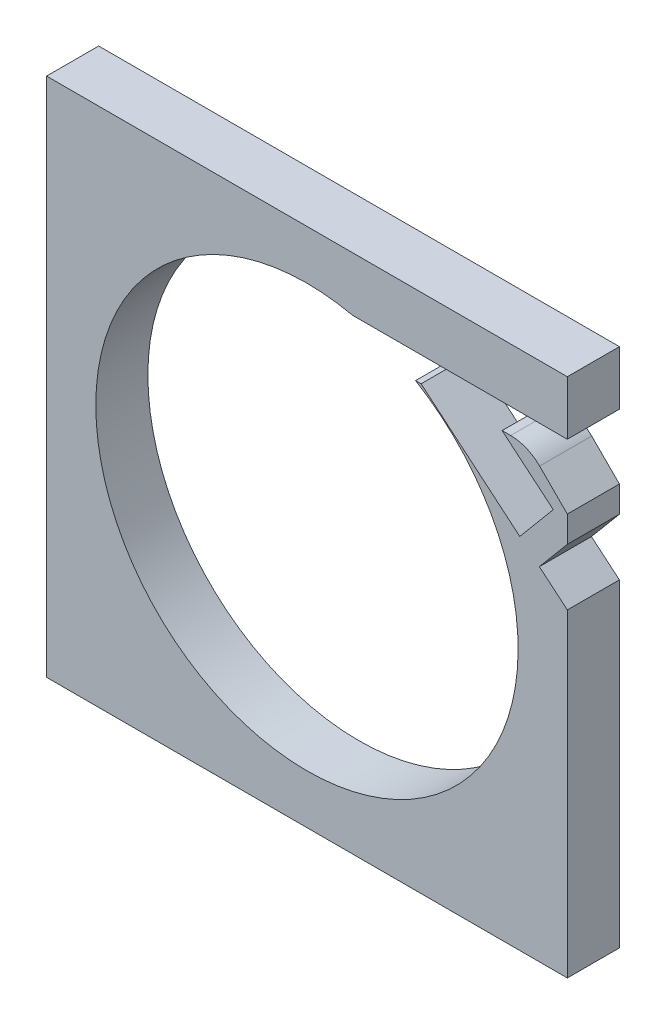
ISO-10303-21;
HEADER;
FILE_DESCRIPTION(('STEP AP214'),'2;1');
FILE_NAME('part.step','',(''),(''),'','','');
FILE_SCHEMA(('AUTOMOTIVE_DESIGN { 1 0 10303 214 1 1 1 1 }'));
ENDSEC;
DATA;
#1=APPLICATION_CONTEXT('core data for automotive mechanical design processes');
#2=APPLICATION_PROTOCOL_DEFINITION('international standard','automotive_design',2000,#1);
#3=PRODUCT_CONTEXT('',#1,'mechanical');
#4=PRODUCT('Part','Part','',(#3));
#5=PRODUCT_RELATED_PRODUCT_CATEGORY('part','',(#4));
#6=PRODUCT_DEFINITION_FORMATION('','',#4);
#7=PRODUCT_DEFINITION_CONTEXT('part definition',#1,'design');
#8=PRODUCT_DEFINITION('design','',#6,#7);
#9=PRODUCT_DEFINITION_SHAPE('','',#8);
#10=(LENGTH_UNIT() NAMED_UNIT(*) SI_UNIT(.MILLI.,.METRE.));
#11=(NAMED_UNIT(*) PLANE_ANGLE_UNIT() SI_UNIT($,.RADIAN.));
#12=(NAMED_UNIT(*) SI_UNIT($,.STERADIAN.) SOLID_ANGLE_UNIT());
#13=UNCERTAINTY_MEASURE_WITH_UNIT(LENGTH_MEASURE(1.E-05),#10,'distance_accuracy_value','');
#14=(GEOMETRIC_REPRESENTATION_CONTEXT(3) GLOBAL_UNCERTAINTY_ASSIGNED_CONTEXT((#13)) GLOBAL_UNIT_ASSIGNED_CONTEXT((#10,
#11,#12)) REPRESENTATION_CONTEXT('',''));
#15=CARTESIAN_POINT('',(0.,0.,0.));
#16=DIRECTION('',(0.,0.,1.));
#17=DIRECTION('',(1.,0.,0.));
#18=AXIS2_PLACEMENT_3D('',#15,#16,#17);
#19=CARTESIAN_POINT('',(63.5,63.5,12.7));
#20=DIRECTION('',(-1.,0.,0.));
#21=DIRECTION('',(0.,-1.,0.));
#22=AXIS2_PLACEMENT_3D('',#19,#20,#21);
#23=PLANE('',#22);
#24=DIRECTION('',(0.,1.,0.));
#25=VECTOR('',#24,1.);
#26=CARTESIAN_POINT('',(63.5,63.5,0.));
#27=LINE('',#26,#25);
#28=CARTESIAN_POINT('',(63.5,-63.5,0.));
#29=VERTEX_POINT('',#28);
#30=CARTESIAN_POINT('',(63.5,14.2427416836817,0.));
#31=VERTEX_POINT('',#30);
#32=EDGE_CURVE('E197',#29,#31,#27,.T.);
#33=ORIENTED_EDGE('',*,*,#32,.T.);
#34=DIRECTION('',(0.,0.,1.));
#35=VECTOR('',#34,1.);
#36=CARTESIAN_POINT('',(63.5,14.2427416836817,-0.000999999999999265));
#37=LINE('',#36,#35);
#38=CARTESIAN_POINT('',(63.5,14.2427416836817,12.7));
#39=VERTEX_POINT('',#38);
#40=EDGE_CURVE('E266',#31,#39,#37,.T.);
#41=ORIENTED_EDGE('',*,*,#40,.T.);
#42=DIRECTION('',(0.,1.,0.));
#43=VECTOR('',#42,1.);
#44=CARTESIAN_POINT('',(63.5,63.5,12.7));
#45=LINE('',#44,#43);
#46=CARTESIAN_POINT('',(63.5,-63.5,12.7));
#47=VERTEX_POINT('',#46);
#48=EDGE_CURVE('E185',#47,#39,#45,.T.);
#49=ORIENTED_EDGE('',*,*,#48,.F.);
#50=DIRECTION('',(0.,0.,-1.));
#51=VECTOR('',#50,1.);
#52=CARTESIAN_POINT('',(63.5,-63.5,12.7));
#53=LINE('',#52,#51);
#54=EDGE_CURVE('E196',#47,#29,#53,.T.);
#55=ORIENTED_EDGE('',*,*,#54,.T.);
#56=EDGE_LOOP('',(#33,#41,#49,#55));
#57=FACE_BOUND('',#56,.T.);
#58=ADVANCED_FACE('F32',(#57),#23,.F.);
#59=CARTESIAN_POINT('',(63.5,50.2852471751917,12.7));
#60=VERTEX_POINT('',#59);
#61=CARTESIAN_POINT('',(63.5,63.5,12.7));
#62=VERTEX_POINT('',#61);
#63=EDGE_CURVE('E190',#60,#62,#45,.T.);
#64=ORIENTED_EDGE('',*,*,#63,.F.);
#65=DIRECTION('',(0.,0.,1.));
#66=VECTOR('',#65,1.);
#67=CARTESIAN_POINT('',(63.5,50.2852471751917,-0.000999999999999265));
#68=LINE('',#67,#66);
#69=CARTESIAN_POINT('',(63.5,50.2852471751917,0.));
#70=VERTEX_POINT('',#69);
#71=EDGE_CURVE('E177',#70,#60,#68,.T.);
#72=ORIENTED_EDGE('',*,*,#71,.F.);
#73=CARTESIAN_POINT('',(63.5,63.5,0.));
#74=VERTEX_POINT('',#73);
#75=EDGE_CURVE('E179',#70,#74,#27,.T.);
#76=ORIENTED_EDGE('',*,*,#75,.T.);
#77=DIRECTION('',(0.,0.,-1.));
#78=VECTOR('',#77,1.);
#79=CARTESIAN_POINT('',(63.5,63.5,12.7));
#80=LINE('',#79,#78);
#81=EDGE_CURVE('E215',#62,#74,#80,.T.);
#82=ORIENTED_EDGE('',*,*,#81,.F.);
#83=EDGE_LOOP('',(#64,#72,#76,#82));
#84=FACE_BOUND('',#83,.T.);
#85=ADVANCED_FACE('F308',(#84),#23,.F.);
#86=CARTESIAN_POINT('',(63.5,28.0993720915561,12.7));
#87=VERTEX_POINT('',#86);
#88=CARTESIAN_POINT('',(63.5,34.4892924451917,12.7));
#89=VERTEX_POINT('',#88);
#90=EDGE_CURVE('E189',#87,#89,#45,.T.);
#91=ORIENTED_EDGE('',*,*,#90,.F.);
#92=DIRECTION('',(0.,0.,1.));
#93=VECTOR('',#92,1.);
#94=CARTESIAN_POINT('',(63.5,28.0993720915561,-0.000999999999999265));
#95=LINE('',#94,#93);
#96=CARTESIAN_POINT('',(63.5,28.0993720915561,0.));
#97=VERTEX_POINT('',#96);
#98=EDGE_CURVE('E269',#97,#87,#95,.T.);
#99=ORIENTED_EDGE('',*,*,#98,.F.);
#100=CARTESIAN_POINT('',(63.5,34.4892924451917,0.));
#101=VERTEX_POINT('',#100);
#102=EDGE_CURVE('E201',#97,#101,#27,.T.);
#103=ORIENTED_EDGE('',*,*,#102,.T.);
#104=DIRECTION('',(0.,0.,1.));
#105=VECTOR('',#104,1.);
#106=CARTESIAN_POINT('',(63.5,34.4892924451917,-0.000999999999999265));
#107=LINE('',#106,#105);
#108=EDGE_CURVE('E181',#101,#89,#107,.T.);
#109=ORIENTED_EDGE('',*,*,#108,.T.);
#110=EDGE_LOOP('',(#91,#99,#103,#109));
#111=FACE_BOUND('',#110,.T.);
#112=ADVANCED_FACE('F330',(#111),#23,.F.);
#113=CARTESIAN_POINT('',(-63.5,63.5,12.7));
#114=DIRECTION('',(0.,-1.,0.));
#115=DIRECTION('',(0.,0.,-1.));
#116=AXIS2_PLACEMENT_3D('',#113,#114,#115);
#117=PLANE('',#116);
#118=DIRECTION('',(-1.,0.,0.));
#119=VECTOR('',#118,1.);
#120=CARTESIAN_POINT('',(-63.5,63.5,0.));
#121=LINE('',#120,#119);
#122=CARTESIAN_POINT('',(-63.5,63.5,0.));
#123=VERTEX_POINT('',#122);
#124=EDGE_CURVE('E200',#74,#123,#121,.T.);
#125=ORIENTED_EDGE('',*,*,#124,.T.);
#126=DIRECTION('',(0.,0.,-1.));
#127=VECTOR('',#126,1.);
#128=CARTESIAN_POINT('',(-63.5,63.5,12.7));
#129=LINE('',#128,#127);
#130=CARTESIAN_POINT('',(-63.5,63.5,12.7));
#131=VERTEX_POINT('',#130);
#132=EDGE_CURVE('E212',#131,#123,#129,.T.);
#133=ORIENTED_EDGE('',*,*,#132,.F.);
#134=DIRECTION('',(-1.,0.,0.));
#135=VECTOR('',#134,1.);
#136=CARTESIAN_POINT('',(-63.5,63.5,12.7));
#137=LINE('',#136,#135);
#138=EDGE_CURVE('E188',#62,#131,#137,.T.);
#139=ORIENTED_EDGE('',*,*,#138,.F.);
#140=ORIENTED_EDGE('',*,*,#81,.T.);
#141=EDGE_LOOP('',(#125,#133,#139,#140));
#142=FACE_BOUND('',#141,.T.);
#143=ADVANCED_FACE('F314',(#142),#117,.F.);
#144=CARTESIAN_POINT('',(-63.5,63.5,12.7));
#145=DIRECTION('',(1.,0.,0.));
#146=DIRECTION('',(0.,0.,-1.));
#147=AXIS2_PLACEMENT_3D('',#144,#145,#146);
#148=PLANE('',#147);
#149=DIRECTION('',(0.,-1.,0.));
#150=VECTOR('',#149,1.);
#151=CARTESIAN_POINT('',(-63.5,63.5,0.));
#152=LINE('',#151,#150);
#153=CARTESIAN_POINT('',(-63.5,-63.5,0.));
#154=VERTEX_POINT('',#153);
#155=EDGE_CURVE('E203',#123,#154,#152,.T.);
#156=ORIENTED_EDGE('',*,*,#155,.T.);
#157=DIRECTION('',(0.,0.,-1.));
#158=VECTOR('',#157,1.);
#159=CARTESIAN_POINT('',(-63.5,-63.5,12.7));
#160=LINE('',#159,#158);
#161=CARTESIAN_POINT('',(-63.5,-63.5,12.7));
#162=VERTEX_POINT('',#161);
#163=EDGE_CURVE('E209',#162,#154,#160,.T.);
#164=ORIENTED_EDGE('',*,*,#163,.F.);
#165=DIRECTION('',(0.,-1.,0.));
#166=VECTOR('',#165,1.);
#167=CARTESIAN_POINT('',(-63.5,63.5,12.7));
#168=LINE('',#167,#166);
#169=EDGE_CURVE('E192',#131,#162,#168,.T.);
#170=ORIENTED_EDGE('',*,*,#169,.F.);
#171=ORIENTED_EDGE('',*,*,#132,.T.);
#172=EDGE_LOOP('',(#156,#164,#170,#171));
#173=FACE_BOUND('',#172,.T.);
#174=ADVANCED_FACE('F339',(#173),#148,.F.);
#175=CARTESIAN_POINT('',(-63.5,-63.5,12.7));
#176=DIRECTION('',(0.,1.,0.));
#177=DIRECTION('',(0.,0.,1.));
#178=AXIS2_PLACEMENT_3D('',#175,#176,#177);
#179=PLANE('',#178);
#180=DIRECTION('',(1.,0.,0.));
#181=VECTOR('',#180,1.);
#182=CARTESIAN_POINT('',(-63.5,-63.5,0.));
#183=LINE('',#182,#181);
#184=EDGE_CURVE('E205',#154,#29,#183,.T.);
#185=ORIENTED_EDGE('',*,*,#184,.T.);
#186=ORIENTED_EDGE('',*,*,#54,.F.);
#187=DIRECTION('',(1.,0.,0.));
#188=VECTOR('',#187,1.);
#189=CARTESIAN_POINT('',(-63.5,-63.5,12.7));
#190=LINE('',#189,#188);
#191=EDGE_CURVE('E194',#162,#47,#190,.T.);
#192=ORIENTED_EDGE('',*,*,#191,.F.);
#193=ORIENTED_EDGE('',*,*,#163,.T.);
#194=EDGE_LOOP('',(#185,#186,#192,#193));
#195=FACE_BOUND('',#194,.T.);
#196=ADVANCED_FACE('F350',(#195),#179,.F.);
#197=CARTESIAN_POINT('',(0.,0.,12.7));
#198=DIRECTION('',(0.,0.,1.));
#199=DIRECTION('',(1.,0.,0.));
#200=AXIS2_PLACEMENT_3D('',#197,#198,#199);
#201=PLANE('',#200);
#202=DIRECTION('',(0.707106781186551,-0.707106781186544,0.));
#203=VECTOR('',#202,1.);
#204=CARTESIAN_POINT('',(63.5,34.4892924451917,12.7));
#205=LINE('',#204,#203);
#206=CARTESIAN_POINT('',(56.7471306403647,41.2421618048269,12.7));
#207=VERTEX_POINT('',#206);
#208=EDGE_CURVE('E228',#207,#89,#205,.T.);
#209=ORIENTED_EDGE('',*,*,#208,.F.);
#210=CARTESIAN_POINT('',(49.6760628284993,34.1710939929614,12.7));
#211=DIRECTION('',(0.,0.,1.));
#212=DIRECTION('',(1.,0.,0.));
#213=AXIS2_PLACEMENT_3D('',#210,#211,#212);
#214=CIRCLE('',#213,10.);
#215=CARTESIAN_POINT('',(49.6760628284993,44.1710939929614,12.7));
#216=VERTEX_POINT('',#215);
#217=EDGE_CURVE('E54',#207,#216,#214,.T.);
#218=ORIENTED_EDGE('',*,*,#217,.T.);
#219=DIRECTION('',(1.,0.,0.));
#220=VECTOR('',#219,1.);
#221=CARTESIAN_POINT('',(57.1386467105627,44.1710939929614,12.7));
#222=LINE('',#221,#220);
#223=CARTESIAN_POINT('',(47.590471216118,44.1710939929614,12.7));
#224=VERTEX_POINT('',#223);
#225=EDGE_CURVE('E170',#224,#216,#222,.T.);
#226=ORIENTED_EDGE('',*,*,#225,.F.);
#227=DIRECTION('',(-0.766044443118977,0.64278760968654,0.));
#228=VECTOR('',#227,1.);
#229=CARTESIAN_POINT('',(41.495660788118,49.2852471751917,12.7));
#230=LINE('',#229,#228);
#231=CARTESIAN_POINT('',(60.0751818231,33.6951779272877,12.7));
#232=VERTEX_POINT('',#231);
#233=EDGE_CURVE('E252',#232,#224,#230,.T.);
#234=ORIENTED_EDGE('',*,*,#233,.F.);
#235=DIRECTION('',(0.64278760968654,0.766044443118977,0.));
#236=VECTOR('',#235,1.);
#237=CARTESIAN_POINT('',(60.0751818231,33.6951779272877,12.7));
#238=LINE('',#237,#236);
#239=CARTESIAN_POINT('',(51.9117791800809,23.9664134996767,12.7));
#240=VERTEX_POINT('',#239);
#241=EDGE_CURVE('E256',#240,#232,#238,.T.);
#242=ORIENTED_EDGE('',*,*,#241,.F.);
#243=DIRECTION('',(0.766044443118977,-0.64278760968654,0.));
#244=VECTOR('',#243,1.);
#245=CARTESIAN_POINT('',(51.9117791800809,23.9664134996767,12.7));
#246=LINE('',#245,#244);
#247=CARTESIAN_POINT('',(27.8327786149908,44.1710939929614,12.7));
#248=VERTEX_POINT('',#247);
#249=EDGE_CURVE('E168',#248,#240,#246,.T.);
#250=ORIENTED_EDGE('',*,*,#249,.F.);
#251=CARTESIAN_POINT('',(26.4795101062118,44.1710939929614,12.7));
#252=VERTEX_POINT('',#251);
#253=EDGE_CURVE('E152',#252,#248,#222,.T.);
#254=ORIENTED_EDGE('',*,*,#253,.F.);
#255=CARTESIAN_POINT('',(0.,0.,12.7));
#256=DIRECTION('',(0.,0.,1.));
#257=DIRECTION('',(1.,0.,0.));
#258=AXIS2_PLACEMENT_3D('',#255,#256,#257);
#259=CIRCLE('',#258,51.5);
#260=CARTESIAN_POINT('',(11.1195286109564,50.2852471751917,12.7));
#261=VERTEX_POINT('',#260);
#262=EDGE_CURVE('E166',#261,#252,#259,.T.);
#263=ORIENTED_EDGE('',*,*,#262,.F.);
#264=DIRECTION('',(-1.,0.,0.));
#265=VECTOR('',#264,1.);
#266=CARTESIAN_POINT('',(0.,50.2852471751917,12.7));
#267=LINE('',#266,#265);
#268=EDGE_CURVE('E237',#60,#261,#267,.T.);
#269=ORIENTED_EDGE('',*,*,#268,.F.);
#270=ORIENTED_EDGE('',*,*,#63,.T.);
#271=ORIENTED_EDGE('',*,*,#138,.T.);
#272=ORIENTED_EDGE('',*,*,#169,.T.);
#273=ORIENTED_EDGE('',*,*,#191,.T.);
#274=ORIENTED_EDGE('',*,*,#48,.T.);
#275=DIRECTION('',(0.766044443118977,-0.642787609686541,0.));
#276=VECTOR('',#275,1.);
#277=CARTESIAN_POINT('',(56.6769414718503,19.9679675781531,12.7));
#278=LINE('',#277,#276);
#279=CARTESIAN_POINT('',(56.6769414718503,19.9679675781531,12.7));
#280=VERTEX_POINT('',#279);
#281=EDGE_CURVE('E275',#280,#39,#278,.T.);
#282=ORIENTED_EDGE('',*,*,#281,.F.);
#283=DIRECTION('',(-0.64278760968654,-0.766044443118978,0.));
#284=VECTOR('',#283,1.);
#285=CARTESIAN_POINT('',(56.6769414718503,19.9679675781531,12.7));
#286=LINE('',#285,#284);
#287=EDGE_CURVE('E270',#87,#280,#286,.T.);
#288=ORIENTED_EDGE('',*,*,#287,.F.);
#289=ORIENTED_EDGE('',*,*,#90,.T.);
#290=EDGE_LOOP('',(#209,#218,#226,#234,#242,#250,#254,#263,#269,#270,#271,#272,#273,#274,#282,
#288,#289));
#291=FACE_BOUND('',#290,.T.);
#292=ADVANCED_FACE('F164',(#291),#201,.T.);
#293=CARTESIAN_POINT('',(0.,0.,0.));
#294=DIRECTION('',(0.,0.,1.));
#295=DIRECTION('',(1.,0.,0.));
#296=AXIS2_PLACEMENT_3D('',#293,#294,#295);
#297=PLANE('',#296);
#298=DIRECTION('',(1.,0.,0.));
#299=VECTOR('',#298,1.);
#300=CARTESIAN_POINT('',(57.1386467105627,44.1710939929614,0.));
#301=LINE('',#300,#299);
#302=CARTESIAN_POINT('',(47.5904712161181,44.1710939929614,0.));
#303=VERTEX_POINT('',#302);
#304=CARTESIAN_POINT('',(49.6760628284993,44.1710939929614,0.));
#305=VERTEX_POINT('',#304);
#306=EDGE_CURVE('E169',#303,#305,#301,.T.);
#307=ORIENTED_EDGE('',*,*,#306,.T.);
#308=CARTESIAN_POINT('',(49.6760628284993,34.1710939929614,0.));
#309=DIRECTION('',(0.,0.,1.));
#310=DIRECTION('',(1.,0.,0.));
#311=AXIS2_PLACEMENT_3D('',#308,#309,#310);
#312=CIRCLE('',#311,10.);
#313=CARTESIAN_POINT('',(56.7471306403647,41.2421618048269,0.));
#314=VERTEX_POINT('',#313);
#315=EDGE_CURVE('E11',#305,#314,#312,.F.);
#316=ORIENTED_EDGE('',*,*,#315,.T.);
#317=DIRECTION('',(-0.707106781186551,0.707106781186544,0.));
#318=VECTOR('',#317,1.);
#319=CARTESIAN_POINT('',(63.5,34.4892924451917,0.));
#320=LINE('',#319,#318);
#321=EDGE_CURVE('E231',#101,#314,#320,.T.);
#322=ORIENTED_EDGE('',*,*,#321,.F.);
#323=ORIENTED_EDGE('',*,*,#102,.F.);
#324=DIRECTION('',(0.64278760968654,0.766044443118978,0.));
#325=VECTOR('',#324,1.);
#326=CARTESIAN_POINT('',(56.6769414718503,19.9679675781531,0.));
#327=LINE('',#326,#325);
#328=CARTESIAN_POINT('',(56.6769414718503,19.9679675781531,0.));
#329=VERTEX_POINT('',#328);
#330=EDGE_CURVE('E159',#329,#97,#327,.T.);
#331=ORIENTED_EDGE('',*,*,#330,.F.);
#332=DIRECTION('',(-0.766044443118977,0.642787609686541,0.));
#333=VECTOR('',#332,1.);
#334=CARTESIAN_POINT('',(56.6769414718503,19.9679675781531,0.));
#335=LINE('',#334,#333);
#336=EDGE_CURVE('E277',#31,#329,#335,.T.);
#337=ORIENTED_EDGE('',*,*,#336,.F.);
#338=ORIENTED_EDGE('',*,*,#32,.F.);
#339=ORIENTED_EDGE('',*,*,#184,.F.);
#340=ORIENTED_EDGE('',*,*,#155,.F.);
#341=ORIENTED_EDGE('',*,*,#124,.F.);
#342=ORIENTED_EDGE('',*,*,#75,.F.);
#343=DIRECTION('',(1.,0.,0.));
#344=VECTOR('',#343,1.);
#345=CARTESIAN_POINT('',(0.,50.2852471751917,0.));
#346=LINE('',#345,#344);
#347=CARTESIAN_POINT('',(11.1195286109564,50.2852471751917,0.));
#348=VERTEX_POINT('',#347);
#349=EDGE_CURVE('E238',#348,#70,#346,.T.);
#350=ORIENTED_EDGE('',*,*,#349,.F.);
#351=CARTESIAN_POINT('',(0.,0.,0.));
#352=DIRECTION('',(0.,0.,1.));
#353=DIRECTION('',(1.,0.,0.));
#354=AXIS2_PLACEMENT_3D('',#351,#352,#353);
#355=CIRCLE('',#354,51.5);
#356=CARTESIAN_POINT('',(26.4795101062118,44.1710939929614,0.));
#357=VERTEX_POINT('',#356);
#358=EDGE_CURVE('E176',#357,#348,#355,.F.);
#359=ORIENTED_EDGE('',*,*,#358,.F.);
#360=CARTESIAN_POINT('',(27.8327786149908,44.1710939929614,0.));
#361=VERTEX_POINT('',#360);
#362=EDGE_CURVE('E155',#357,#361,#301,.T.);
#363=ORIENTED_EDGE('',*,*,#362,.T.);
#364=DIRECTION('',(-0.766044443118977,0.64278760968654,0.));
#365=VECTOR('',#364,1.);
#366=CARTESIAN_POINT('',(51.9117791800809,23.9664134996767,0.));
#367=LINE('',#366,#365);
#368=CARTESIAN_POINT('',(51.9117791800809,23.9664134996767,0.));
#369=VERTEX_POINT('',#368);
#370=EDGE_CURVE('E245',#369,#361,#367,.T.);
#371=ORIENTED_EDGE('',*,*,#370,.F.);
#372=DIRECTION('',(-0.64278760968654,-0.766044443118977,0.));
#373=VECTOR('',#372,1.);
#374=CARTESIAN_POINT('',(60.0751818231,33.6951779272877,0.));
#375=LINE('',#374,#373);
#376=CARTESIAN_POINT('',(60.0751818231,33.6951779272877,0.));
#377=VERTEX_POINT('',#376);
#378=EDGE_CURVE('E262',#377,#369,#375,.T.);
#379=ORIENTED_EDGE('',*,*,#378,.F.);
#380=DIRECTION('',(0.766044443118977,-0.64278760968654,0.));
#381=VECTOR('',#380,1.);
#382=CARTESIAN_POINT('',(41.495660788118,49.2852471751917,0.));
#383=LINE('',#382,#381);
#384=EDGE_CURVE('E260',#303,#377,#383,.T.);
#385=ORIENTED_EDGE('',*,*,#384,.F.);
#386=EDGE_LOOP('',(#307,#316,#322,#323,#331,#337,#338,#339,#340,#341,#342,#350,#359,#363,#371,
#379,#385));
#387=FACE_BOUND('',#386,.T.);
#388=ADVANCED_FACE('F285',(#387),#297,.F.);
#389=CARTESIAN_POINT('',(0.,0.,-0.000999999999999265));
#390=DIRECTION('',(0.,0.,1.));
#391=DIRECTION('',(1.,0.,0.));
#392=AXIS2_PLACEMENT_3D('',#389,#390,#391);
#393=CYLINDRICAL_SURFACE('',#392,51.5);
#394=ORIENTED_EDGE('',*,*,#262,.T.);
#395=DIRECTION('',(0.,0.,1.));
#396=VECTOR('',#395,1.);
#397=CARTESIAN_POINT('',(26.4795101062118,44.1710939929614,-0.000999999999999265));
#398=LINE('',#397,#396);
#399=EDGE_CURVE('E149',#252,#357,#398,.F.);
#400=ORIENTED_EDGE('',*,*,#399,.T.);
#401=ORIENTED_EDGE('',*,*,#358,.T.);
#402=DIRECTION('',(0.,0.,1.));
#403=VECTOR('',#402,1.);
#404=CARTESIAN_POINT('',(11.1195286109564,50.2852471751917,-0.000999999999999265));
#405=LINE('',#404,#403);
#406=EDGE_CURVE('E175',#261,#348,#405,.F.);
#407=ORIENTED_EDGE('',*,*,#406,.F.);
#408=EDGE_LOOP('',(#394,#400,#401,#407));
#409=FACE_BOUND('',#408,.T.);
#410=ADVANCED_FACE('F173',(#409),#393,.F.);
#411=CARTESIAN_POINT('',(63.5,34.4892924451917,-0.000999999999999265));
#412=DIRECTION('',(-0.707106781186544,-0.707106781186551,0.));
#413=DIRECTION('',(0.707106781186551,-0.707106781186544,0.));
#414=AXIS2_PLACEMENT_3D('',#411,#412,#413);
#415=PLANE('',#414);
#416=ORIENTED_EDGE('',*,*,#321,.T.);
#417=DIRECTION('',(0.,0.,1.));
#418=VECTOR('',#417,1.);
#419=CARTESIAN_POINT('',(56.7471306403647,41.2421618048269,-0.000999999999999265));
#420=LINE('',#419,#418);
#421=EDGE_CURVE('E220',#314,#207,#420,.T.);
#422=ORIENTED_EDGE('',*,*,#421,.T.);
#423=ORIENTED_EDGE('',*,*,#208,.T.);
#424=ORIENTED_EDGE('',*,*,#108,.F.);
#425=EDGE_LOOP('',(#416,#422,#423,#424));
#426=FACE_BOUND('',#425,.T.);
#427=ADVANCED_FACE('F226',(#426),#415,.F.);
#428=CARTESIAN_POINT('',(0.,50.2852471751917,-0.000999999999999265));
#429=DIRECTION('',(0.,1.,0.));
#430=DIRECTION('',(0.,0.,1.));
#431=AXIS2_PLACEMENT_3D('',#428,#429,#430);
#432=PLANE('',#431);
#433=ORIENTED_EDGE('',*,*,#349,.T.);
#434=ORIENTED_EDGE('',*,*,#71,.T.);
#435=ORIENTED_EDGE('',*,*,#268,.T.);
#436=ORIENTED_EDGE('',*,*,#406,.T.);
#437=EDGE_LOOP('',(#433,#434,#435,#436));
#438=FACE_BOUND('',#437,.T.);
#439=ADVANCED_FACE('F318',(#438),#432,.F.);
#440=CARTESIAN_POINT('',(41.495660788118,49.2852471751917,-0.000999999999999265));
#441=DIRECTION('',(0.64278760968654,0.766044443118977,0.));
#442=DIRECTION('',(-0.766044443118977,0.64278760968654,0.));
#443=AXIS2_PLACEMENT_3D('',#440,#441,#442);
#444=PLANE('',#443);
#445=ORIENTED_EDGE('',*,*,#233,.T.);
#446=DIRECTION('',(0.,0.,-1.));
#447=VECTOR('',#446,1.);
#448=CARTESIAN_POINT('',(47.590471216118,44.1710939929614,-0.000999999999999265));
#449=LINE('',#448,#447);
#450=EDGE_CURVE('E160',#224,#303,#449,.T.);
#451=ORIENTED_EDGE('',*,*,#450,.T.);
#452=ORIENTED_EDGE('',*,*,#384,.T.);
#453=DIRECTION('',(0.,0.,1.));
#454=VECTOR('',#453,1.);
#455=CARTESIAN_POINT('',(60.0751818231,33.6951779272877,-0.000999999999999265));
#456=LINE('',#455,#454);
#457=EDGE_CURVE('E248',#377,#232,#456,.T.);
#458=ORIENTED_EDGE('',*,*,#457,.T.);
#459=EDGE_LOOP('',(#445,#451,#452,#458));
#460=FACE_BOUND('',#459,.T.);
#461=ADVANCED_FACE('F294',(#460),#444,.F.);
#462=CARTESIAN_POINT('',(60.0751818231,33.6951779272877,-0.000999999999999265));
#463=DIRECTION('',(0.766044443118977,-0.64278760968654,0.));
#464=DIRECTION('',(0.64278760968654,0.766044443118977,0.));
#465=AXIS2_PLACEMENT_3D('',#462,#463,#464);
#466=PLANE('',#465);
#467=ORIENTED_EDGE('',*,*,#378,.T.);
#468=DIRECTION('',(0.,0.,1.));
#469=VECTOR('',#468,1.);
#470=CARTESIAN_POINT('',(51.9117791800809,23.9664134996767,-0.000999999999999265));
#471=LINE('',#470,#469);
#472=EDGE_CURVE('E249',#369,#240,#471,.T.);
#473=ORIENTED_EDGE('',*,*,#472,.T.);
#474=ORIENTED_EDGE('',*,*,#241,.T.);
#475=ORIENTED_EDGE('',*,*,#457,.F.);
#476=EDGE_LOOP('',(#467,#473,#474,#475));
#477=FACE_BOUND('',#476,.T.);
#478=ADVANCED_FACE('F292',(#477),#466,.F.);
#479=CARTESIAN_POINT('',(51.9117791800809,23.9664134996767,-0.000999999999999265));
#480=DIRECTION('',(-0.64278760968654,-0.766044443118977,0.));
#481=DIRECTION('',(0.766044443118977,-0.64278760968654,0.));
#482=AXIS2_PLACEMENT_3D('',#479,#480,#481);
#483=PLANE('',#482);
#484=ORIENTED_EDGE('',*,*,#370,.T.);
#485=DIRECTION('',(0.,0.,1.));
#486=VECTOR('',#485,1.);
#487=CARTESIAN_POINT('',(27.8327786149908,44.1710939929614,-0.000999999999999265));
#488=LINE('',#487,#486);
#489=EDGE_CURVE('E218',#361,#248,#488,.T.);
#490=ORIENTED_EDGE('',*,*,#489,.T.);
#491=ORIENTED_EDGE('',*,*,#249,.T.);
#492=ORIENTED_EDGE('',*,*,#472,.F.);
#493=EDGE_LOOP('',(#484,#490,#491,#492));
#494=FACE_BOUND('',#493,.T.);
#495=ADVANCED_FACE('F289',(#494),#483,.F.);
#496=CARTESIAN_POINT('',(56.6769414718503,19.9679675781531,-0.000999999999999265));
#497=DIRECTION('',(-0.642787609686541,-0.766044443118977,0.));
#498=DIRECTION('',(0.766044443118977,-0.642787609686541,0.));
#499=AXIS2_PLACEMENT_3D('',#496,#497,#498);
#500=PLANE('',#499);
#501=ORIENTED_EDGE('',*,*,#336,.T.);
#502=DIRECTION('',(0.,0.,1.));
#503=VECTOR('',#502,1.);
#504=CARTESIAN_POINT('',(56.6769414718503,19.9679675781531,-0.000999999999999265));
#505=LINE('',#504,#503);
#506=EDGE_CURVE('E265',#329,#280,#505,.T.);
#507=ORIENTED_EDGE('',*,*,#506,.T.);
#508=ORIENTED_EDGE('',*,*,#281,.T.);
#509=ORIENTED_EDGE('',*,*,#40,.F.);
#510=EDGE_LOOP('',(#501,#507,#508,#509));
#511=FACE_BOUND('',#510,.T.);
#512=ADVANCED_FACE('F346',(#511),#500,.F.);
#513=CARTESIAN_POINT('',(56.6769414718503,19.9679675781531,-0.000999999999999265));
#514=DIRECTION('',(-0.766044443118977,0.64278760968654,0.));
#515=DIRECTION('',(-0.64278760968654,-0.766044443118978,0.));
#516=AXIS2_PLACEMENT_3D('',#513,#514,#515);
#517=PLANE('',#516);
#518=ORIENTED_EDGE('',*,*,#330,.T.);
#519=ORIENTED_EDGE('',*,*,#98,.T.);
#520=ORIENTED_EDGE('',*,*,#287,.T.);
#521=ORIENTED_EDGE('',*,*,#506,.F.);
#522=EDGE_LOOP('',(#518,#519,#520,#521));
#523=FACE_BOUND('',#522,.T.);
#524=ADVANCED_FACE('F341',(#523),#517,.F.);
#525=CARTESIAN_POINT('',(57.1386467105627,44.1710939929614,0.));
#526=DIRECTION('',(0.,-1.,0.));
#527=DIRECTION('',(1.,0.,0.));
#528=AXIS2_PLACEMENT_3D('',#525,#526,#527);
#529=PLANE('',#528);
#530=ORIENTED_EDGE('',*,*,#253,.T.);
#531=ORIENTED_EDGE('',*,*,#489,.F.);
#532=ORIENTED_EDGE('',*,*,#362,.F.);
#533=ORIENTED_EDGE('',*,*,#399,.F.);
#534=EDGE_LOOP('',(#530,#531,#532,#533));
#535=FACE_BOUND('',#534,.T.);
#536=ADVANCED_FACE('F151',(#535),#529,.F.);
#537=ORIENTED_EDGE('',*,*,#225,.T.);
#538=DIRECTION('',(0.,0.,1.));
#539=VECTOR('',#538,1.);
#540=CARTESIAN_POINT('',(49.6760628284993,44.1710939929614,0.));
#541=LINE('',#540,#539);
#542=EDGE_CURVE('E40',#216,#305,#541,.F.);
#543=ORIENTED_EDGE('',*,*,#542,.T.);
#544=ORIENTED_EDGE('',*,*,#306,.F.);
#545=ORIENTED_EDGE('',*,*,#450,.F.);
#546=EDGE_LOOP('',(#537,#543,#544,#545));
#547=FACE_BOUND('',#546,.T.);
#548=ADVANCED_FACE('F296',(#547),#529,.F.);
#549=CARTESIAN_POINT('',(49.6760628284993,34.1710939929614,-0.000999999999999265));
#550=DIRECTION('',(0.,0.,1.));
#551=DIRECTION('',(1.,0.,0.));
#552=AXIS2_PLACEMENT_3D('',#549,#550,#551);
#553=CYLINDRICAL_SURFACE('',#552,10.);
#554=ORIENTED_EDGE('',*,*,#315,.F.);
#555=ORIENTED_EDGE('',*,*,#542,.F.);
#556=ORIENTED_EDGE('',*,*,#217,.F.);
#557=ORIENTED_EDGE('',*,*,#421,.F.);
#558=EDGE_LOOP('',(#554,#555,#556,#557));
#559=FACE_BOUND('',#558,.T.);
#560=ADVANCED_FACE('F34',(#559),#553,.T.);
#561=CLOSED_SHELL('',(#58,#85,#112,#143,#174,#196,#292,#388,#410,#427,#439,#461,#478,#495,#512,
#524,#536,#548,#560));
#562=MANIFOLD_SOLID_BREP('B2',#561);
#563=ADVANCED_BREP_SHAPE_REPRESENTATION('',(#18,#562),#14);
#564=SHAPE_DEFINITION_REPRESENTATION(#9,#563);
ENDSEC;
END-ISO-10303-21;
